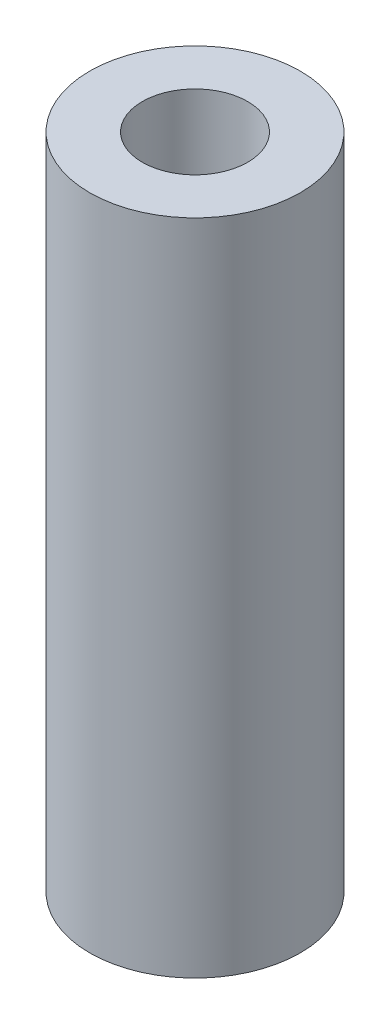
ISO-10303-21;
HEADER;
FILE_DESCRIPTION(('STEP AP214'),'2;1');
FILE_NAME('part.step','',(''),(''),'','','');
FILE_SCHEMA(('AUTOMOTIVE_DESIGN { 1 0 10303 214 1 1 1 1 }'));
ENDSEC;
DATA;
#1=APPLICATION_CONTEXT('core data for automotive mechanical design processes');
#2=APPLICATION_PROTOCOL_DEFINITION('international standard','automotive_design',2000,#1);
#3=PRODUCT_CONTEXT('',#1,'mechanical');
#4=PRODUCT('Part','Part','',(#3));
#5=PRODUCT_RELATED_PRODUCT_CATEGORY('part','',(#4));
#6=PRODUCT_DEFINITION_FORMATION('','',#4);
#7=PRODUCT_DEFINITION_CONTEXT('part definition',#1,'design');
#8=PRODUCT_DEFINITION('design','',#6,#7);
#9=PRODUCT_DEFINITION_SHAPE('','',#8);
#10=(LENGTH_UNIT() NAMED_UNIT(*) SI_UNIT(.MILLI.,.METRE.));
#11=(NAMED_UNIT(*) PLANE_ANGLE_UNIT() SI_UNIT($,.RADIAN.));
#12=(NAMED_UNIT(*) SI_UNIT($,.STERADIAN.) SOLID_ANGLE_UNIT());
#13=UNCERTAINTY_MEASURE_WITH_UNIT(LENGTH_MEASURE(1.E-05),#10,'distance_accuracy_value','');
#14=(GEOMETRIC_REPRESENTATION_CONTEXT(3) GLOBAL_UNCERTAINTY_ASSIGNED_CONTEXT((#13)) GLOBAL_UNIT_ASSIGNED_CONTEXT((#10,
#11,#12)) REPRESENTATION_CONTEXT('',''));
#15=CARTESIAN_POINT('',(0.,0.,0.));
#16=DIRECTION('',(0.,0.,1.));
#17=DIRECTION('',(1.,0.,0.));
#18=AXIS2_PLACEMENT_3D('',#15,#16,#17);
#19=CARTESIAN_POINT('',(0.,30.,0.));
#20=DIRECTION('',(0.,1.,0.));
#21=DIRECTION('',(0.,0.,1.));
#22=AXIS2_PLACEMENT_3D('',#19,#20,#21);
#23=PLANE('',#22);
#24=CARTESIAN_POINT('',(0.,30.,0.));
#25=DIRECTION('',(0.,1.,0.));
#26=DIRECTION('',(0.,0.,1.));
#27=AXIS2_PLACEMENT_3D('',#24,#25,#26);
#28=CIRCLE('',#27,8.);
#29=CARTESIAN_POINT('',(0.,30.,8.));
#30=VERTEX_POINT('',#29);
#31=EDGE_CURVE('E10',#30,#30,#28,.T.);
#32=ORIENTED_EDGE('',*,*,#31,.T.);
#33=EDGE_LOOP('',(#32));
#34=FACE_BOUND('',#33,.T.);
#35=CARTESIAN_POINT('',(0.,30.,0.));
#36=DIRECTION('',(0.,1.,0.));
#37=DIRECTION('',(0.,0.,1.));
#38=AXIS2_PLACEMENT_3D('',#35,#36,#37);
#39=CIRCLE('',#38,4.);
#40=CARTESIAN_POINT('',(0.,30.,4.));
#41=VERTEX_POINT('',#40);
#42=EDGE_CURVE('E42',#41,#41,#39,.T.);
#43=ORIENTED_EDGE('',*,*,#42,.F.);
#44=EDGE_LOOP('',(#43));
#45=FACE_BOUND('',#44,.T.);
#46=ADVANCED_FACE('F35',(#34,#45),#23,.T.);
#47=CARTESIAN_POINT('',(0.,30.,0.));
#48=DIRECTION('',(0.,-1.,0.));
#49=DIRECTION('',(0.,0.,-1.));
#50=AXIS2_PLACEMENT_3D('',#47,#48,#49);
#51=CYLINDRICAL_SURFACE('',#50,8.);
#52=ORIENTED_EDGE('',*,*,#31,.F.);
#53=EDGE_LOOP('',(#52));
#54=FACE_BOUND('',#53,.T.);
#55=CARTESIAN_POINT('',(0.,-20.,0.));
#56=DIRECTION('',(0.,-1.,0.));
#57=DIRECTION('',(0.,0.,-1.));
#58=AXIS2_PLACEMENT_3D('',#55,#56,#57);
#59=CIRCLE('',#58,8.);
#60=CARTESIAN_POINT('',(0.,-20.,-8.));
#61=VERTEX_POINT('',#60);
#62=EDGE_CURVE('E46',#61,#61,#59,.T.);
#63=ORIENTED_EDGE('',*,*,#62,.F.);
#64=EDGE_LOOP('',(#63));
#65=FACE_BOUND('',#64,.T.);
#66=ADVANCED_FACE('F37',(#54,#65),#51,.T.);
#67=CARTESIAN_POINT('',(0.,30.,0.));
#68=DIRECTION('',(0.,-1.,0.));
#69=DIRECTION('',(0.,0.,-1.));
#70=AXIS2_PLACEMENT_3D('',#67,#68,#69);
#71=CYLINDRICAL_SURFACE('',#70,4.);
#72=ORIENTED_EDGE('',*,*,#42,.T.);
#73=EDGE_LOOP('',(#72));
#74=FACE_BOUND('',#73,.T.);
#75=CARTESIAN_POINT('',(0.,-20.,0.));
#76=DIRECTION('',(0.,-1.,0.));
#77=DIRECTION('',(0.,0.,-1.));
#78=AXIS2_PLACEMENT_3D('',#75,#76,#77);
#79=CIRCLE('',#78,4.);
#80=CARTESIAN_POINT('',(0.,-20.,-4.));
#81=VERTEX_POINT('',#80);
#82=EDGE_CURVE('E50',#81,#81,#79,.T.);
#83=ORIENTED_EDGE('',*,*,#82,.T.);
#84=EDGE_LOOP('',(#83));
#85=FACE_BOUND('',#84,.T.);
#86=ADVANCED_FACE('F56',(#74,#85),#71,.F.);
#87=CARTESIAN_POINT('',(0.,-20.,0.));
#88=DIRECTION('',(0.,-1.,0.));
#89=DIRECTION('',(0.,0.,-1.));
#90=AXIS2_PLACEMENT_3D('',#87,#88,#89);
#91=PLANE('',#90);
#92=ORIENTED_EDGE('',*,*,#62,.T.);
#93=EDGE_LOOP('',(#92));
#94=FACE_BOUND('',#93,.T.);
#95=ORIENTED_EDGE('',*,*,#82,.F.);
#96=EDGE_LOOP('',(#95));
#97=FACE_BOUND('',#96,.T.);
#98=ADVANCED_FACE('F58',(#94,#97),#91,.T.);
#99=CLOSED_SHELL('',(#46,#66,#86,#98));
#100=MANIFOLD_SOLID_BREP('B2',#99);
#101=ADVANCED_BREP_SHAPE_REPRESENTATION('',(#18,#100),#14);
#102=SHAPE_DEFINITION_REPRESENTATION(#9,#101);
ENDSEC;
END-ISO-10303-21;
